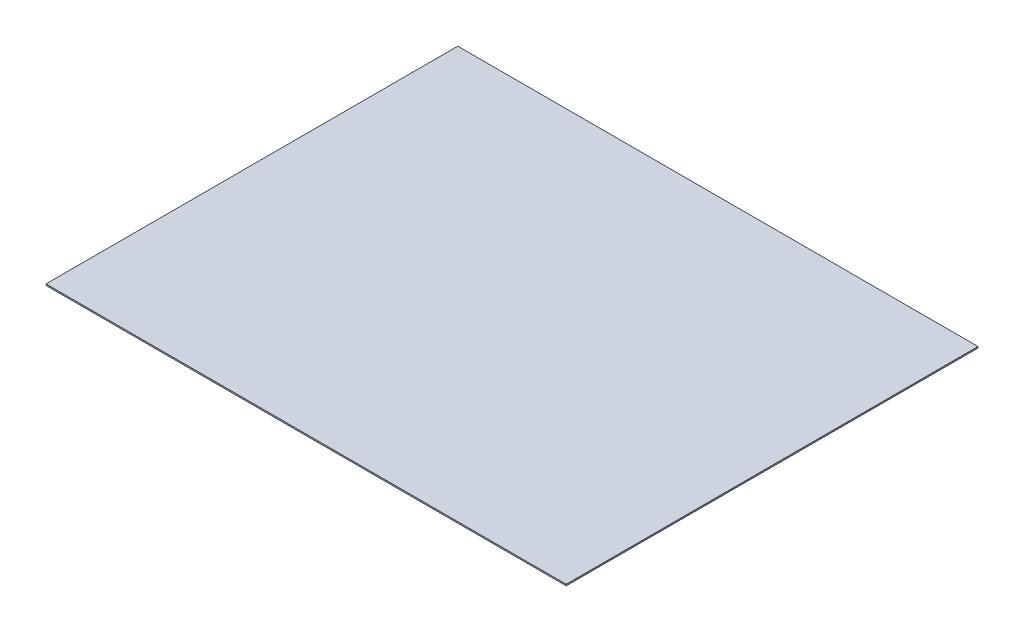
ISO-10303-21;
HEADER;
FILE_DESCRIPTION(('STEP AP214'),'2;1');
FILE_NAME('part.step','',(''),(''),'','','');
FILE_SCHEMA(('AUTOMOTIVE_DESIGN { 1 0 10303 214 1 1 1 1 }'));
ENDSEC;
DATA;
#1=APPLICATION_CONTEXT('core data for automotive mechanical design processes');
#2=APPLICATION_PROTOCOL_DEFINITION('international standard','automotive_design',2000,#1);
#3=PRODUCT_CONTEXT('',#1,'mechanical');
#4=PRODUCT('Part','Part','',(#3));
#5=PRODUCT_RELATED_PRODUCT_CATEGORY('part','',(#4));
#6=PRODUCT_DEFINITION_FORMATION('','',#4);
#7=PRODUCT_DEFINITION_CONTEXT('part definition',#1,'design');
#8=PRODUCT_DEFINITION('design','',#6,#7);
#9=PRODUCT_DEFINITION_SHAPE('','',#8);
#10=(LENGTH_UNIT() NAMED_UNIT(*) SI_UNIT(.MILLI.,.METRE.));
#11=(NAMED_UNIT(*) PLANE_ANGLE_UNIT() SI_UNIT($,.RADIAN.));
#12=(NAMED_UNIT(*) SI_UNIT($,.STERADIAN.) SOLID_ANGLE_UNIT());
#13=UNCERTAINTY_MEASURE_WITH_UNIT(LENGTH_MEASURE(1.E-05),#10,'distance_accuracy_value','');
#14=(GEOMETRIC_REPRESENTATION_CONTEXT(3) GLOBAL_UNCERTAINTY_ASSIGNED_CONTEXT((#13)) GLOBAL_UNIT_ASSIGNED_CONTEXT((#10,
#11,#12)) REPRESENTATION_CONTEXT('',''));
#15=CARTESIAN_POINT('',(0.,0.,0.));
#16=DIRECTION('',(0.,0.,1.));
#17=DIRECTION('',(1.,0.,0.));
#18=AXIS2_PLACEMENT_3D('',#15,#16,#17);
#19=CARTESIAN_POINT('',(0.,10.,0.));
#20=DIRECTION('',(-1.,0.,0.));
#21=DIRECTION('',(0.,0.,1.));
#22=AXIS2_PLACEMENT_3D('',#19,#20,#21);
#23=PLANE('',#22);
#24=DIRECTION('',(0.,0.,-1.));
#25=VECTOR('',#24,1.);
#26=CARTESIAN_POINT('',(0.,0.,0.));
#27=LINE('',#26,#25);
#28=CARTESIAN_POINT('',(0.,0.,0.));
#29=VERTEX_POINT('',#28);
#30=CARTESIAN_POINT('',(0.,0.,-3000.));
#31=VERTEX_POINT('',#30);
#32=EDGE_CURVE('E102',#29,#31,#27,.T.);
#33=ORIENTED_EDGE('',*,*,#32,.F.);
#34=DIRECTION('',(0.,-1.,0.));
#35=VECTOR('',#34,1.);
#36=CARTESIAN_POINT('',(0.,10.,0.));
#37=LINE('',#36,#35);
#38=CARTESIAN_POINT('',(0.,10.,0.));
#39=VERTEX_POINT('',#38);
#40=EDGE_CURVE('E11',#39,#29,#37,.T.);
#41=ORIENTED_EDGE('',*,*,#40,.F.);
#42=DIRECTION('',(0.,0.,-1.));
#43=VECTOR('',#42,1.);
#44=CARTESIAN_POINT('',(0.,10.,0.));
#45=LINE('',#44,#43);
#46=CARTESIAN_POINT('',(0.,10.,-3000.));
#47=VERTEX_POINT('',#46);
#48=EDGE_CURVE('E87',#39,#47,#45,.T.);
#49=ORIENTED_EDGE('',*,*,#48,.T.);
#50=DIRECTION('',(0.,-1.,0.));
#51=VECTOR('',#50,1.);
#52=CARTESIAN_POINT('',(0.,10.,-3000.));
#53=LINE('',#52,#51);
#54=EDGE_CURVE('E55',#47,#31,#53,.T.);
#55=ORIENTED_EDGE('',*,*,#54,.T.);
#56=EDGE_LOOP('',(#33,#41,#49,#55));
#57=FACE_BOUND('',#56,.T.);
#58=ADVANCED_FACE('F39',(#57),#23,.T.);
#59=CARTESIAN_POINT('',(0.,10.,0.));
#60=DIRECTION('',(0.,0.,-1.));
#61=DIRECTION('',(-1.,0.,0.));
#62=AXIS2_PLACEMENT_3D('',#59,#60,#61);
#63=PLANE('',#62);
#64=DIRECTION('',(1.,0.,0.));
#65=VECTOR('',#64,1.);
#66=CARTESIAN_POINT('',(0.,0.,0.));
#67=LINE('',#66,#65);
#68=CARTESIAN_POINT('',(3790.,0.,0.));
#69=VERTEX_POINT('',#68);
#70=EDGE_CURVE('E93',#29,#69,#67,.T.);
#71=ORIENTED_EDGE('',*,*,#70,.T.);
#72=DIRECTION('',(0.,-1.,0.));
#73=VECTOR('',#72,1.);
#74=CARTESIAN_POINT('',(3790.,10.,0.));
#75=LINE('',#74,#73);
#76=CARTESIAN_POINT('',(3790.,10.,0.));
#77=VERTEX_POINT('',#76);
#78=EDGE_CURVE('E47',#77,#69,#75,.T.);
#79=ORIENTED_EDGE('',*,*,#78,.F.);
#80=DIRECTION('',(1.,0.,0.));
#81=VECTOR('',#80,1.);
#82=CARTESIAN_POINT('',(0.,10.,0.));
#83=LINE('',#82,#81);
#84=EDGE_CURVE('E81',#39,#77,#83,.T.);
#85=ORIENTED_EDGE('',*,*,#84,.F.);
#86=ORIENTED_EDGE('',*,*,#40,.T.);
#87=EDGE_LOOP('',(#71,#79,#85,#86));
#88=FACE_BOUND('',#87,.T.);
#89=ADVANCED_FACE('F91',(#88),#63,.F.);
#90=CARTESIAN_POINT('',(3790.,10.,0.));
#91=DIRECTION('',(-1.,0.,0.));
#92=DIRECTION('',(0.,0.,1.));
#93=AXIS2_PLACEMENT_3D('',#90,#91,#92);
#94=PLANE('',#93);
#95=DIRECTION('',(0.,0.,-1.));
#96=VECTOR('',#95,1.);
#97=CARTESIAN_POINT('',(3790.,0.,0.));
#98=LINE('',#97,#96);
#99=CARTESIAN_POINT('',(3790.,0.,-3000.));
#100=VERTEX_POINT('',#99);
#101=EDGE_CURVE('E105',#69,#100,#98,.T.);
#102=ORIENTED_EDGE('',*,*,#101,.T.);
#103=DIRECTION('',(0.,-1.,0.));
#104=VECTOR('',#103,1.);
#105=CARTESIAN_POINT('',(3790.,10.,-3000.));
#106=LINE('',#105,#104);
#107=CARTESIAN_POINT('',(3790.,10.,-3000.));
#108=VERTEX_POINT('',#107);
#109=EDGE_CURVE('E69',#108,#100,#106,.T.);
#110=ORIENTED_EDGE('',*,*,#109,.F.);
#111=DIRECTION('',(0.,0.,-1.));
#112=VECTOR('',#111,1.);
#113=CARTESIAN_POINT('',(3790.,10.,0.));
#114=LINE('',#113,#112);
#115=EDGE_CURVE('E86',#77,#108,#114,.T.);
#116=ORIENTED_EDGE('',*,*,#115,.F.);
#117=ORIENTED_EDGE('',*,*,#78,.T.);
#118=EDGE_LOOP('',(#102,#110,#116,#117));
#119=FACE_BOUND('',#118,.T.);
#120=ADVANCED_FACE('F96',(#119),#94,.F.);
#121=CARTESIAN_POINT('',(0.,10.,-3000.));
#122=DIRECTION('',(0.,0.,-1.));
#123=DIRECTION('',(-1.,0.,0.));
#124=AXIS2_PLACEMENT_3D('',#121,#122,#123);
#125=PLANE('',#124);
#126=DIRECTION('',(1.,0.,0.));
#127=VECTOR('',#126,1.);
#128=CARTESIAN_POINT('',(0.,0.,-3000.));
#129=LINE('',#128,#127);
#130=EDGE_CURVE('E107',#31,#100,#129,.T.);
#131=ORIENTED_EDGE('',*,*,#130,.F.);
#132=ORIENTED_EDGE('',*,*,#54,.F.);
#133=DIRECTION('',(1.,0.,0.));
#134=VECTOR('',#133,1.);
#135=CARTESIAN_POINT('',(0.,10.,-3000.));
#136=LINE('',#135,#134);
#137=EDGE_CURVE('E97',#47,#108,#136,.T.);
#138=ORIENTED_EDGE('',*,*,#137,.T.);
#139=ORIENTED_EDGE('',*,*,#109,.T.);
#140=EDGE_LOOP('',(#131,#132,#138,#139));
#141=FACE_BOUND('',#140,.T.);
#142=ADVANCED_FACE('F112',(#141),#125,.T.);
#143=CARTESIAN_POINT('',(0.,10.,0.));
#144=DIRECTION('',(0.,1.,0.));
#145=DIRECTION('',(0.,0.,1.));
#146=AXIS2_PLACEMENT_3D('',#143,#144,#145);
#147=PLANE('',#146);
#148=ORIENTED_EDGE('',*,*,#48,.F.);
#149=ORIENTED_EDGE('',*,*,#84,.T.);
#150=ORIENTED_EDGE('',*,*,#115,.T.);
#151=ORIENTED_EDGE('',*,*,#137,.F.);
#152=EDGE_LOOP('',(#148,#149,#150,#151));
#153=FACE_BOUND('',#152,.T.);
#154=ADVANCED_FACE('F83',(#153),#147,.T.);
#155=CARTESIAN_POINT('',(0.,0.,0.));
#156=DIRECTION('',(0.,1.,0.));
#157=DIRECTION('',(0.,0.,1.));
#158=AXIS2_PLACEMENT_3D('',#155,#156,#157);
#159=PLANE('',#158);
#160=ORIENTED_EDGE('',*,*,#32,.T.);
#161=ORIENTED_EDGE('',*,*,#130,.T.);
#162=ORIENTED_EDGE('',*,*,#101,.F.);
#163=ORIENTED_EDGE('',*,*,#70,.F.);
#164=EDGE_LOOP('',(#160,#161,#162,#163));
#165=FACE_BOUND('',#164,.T.);
#166=ADVANCED_FACE('F119',(#165),#159,.F.);
#167=CLOSED_SHELL('',(#58,#89,#120,#142,#154,#166));
#168=MANIFOLD_SOLID_BREP('B2',#167);
#169=ADVANCED_BREP_SHAPE_REPRESENTATION('',(#18,#168),#14);
#170=SHAPE_DEFINITION_REPRESENTATION(#9,#169);
ENDSEC;
END-ISO-10303-21;
